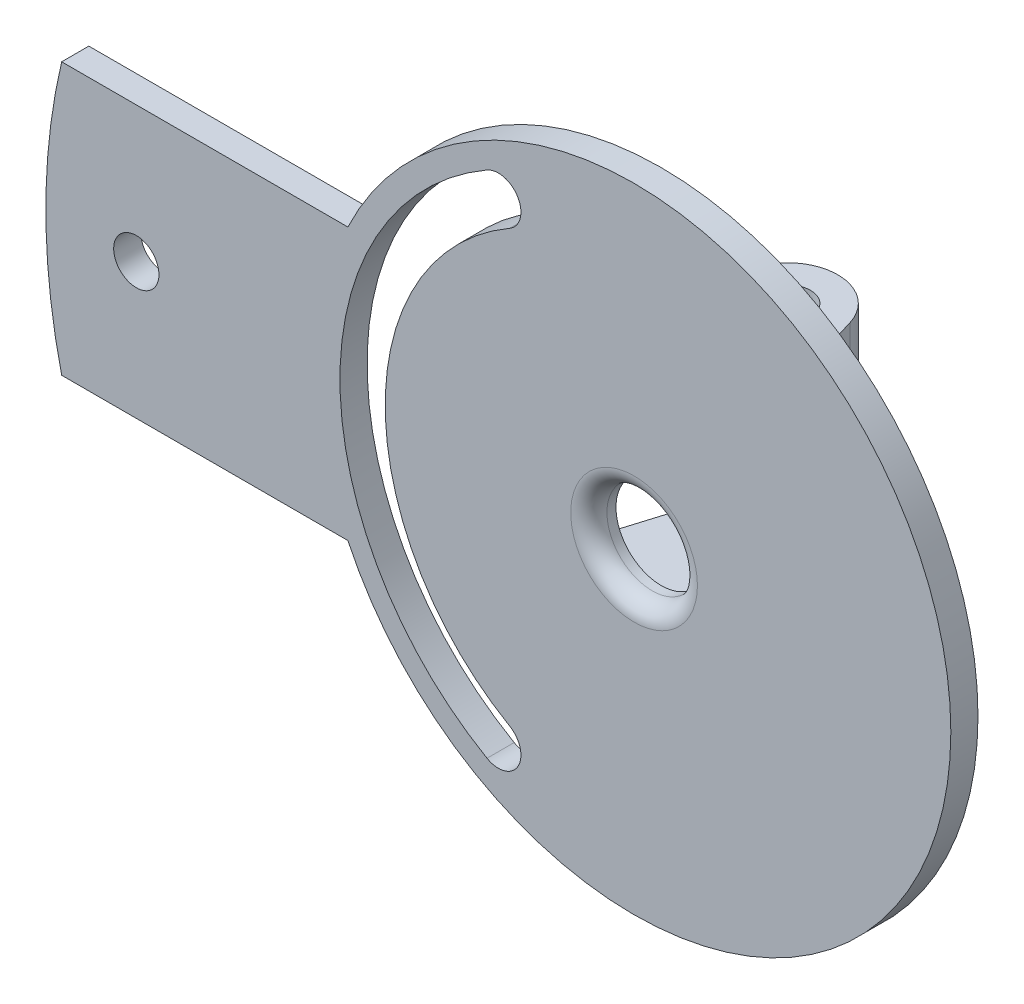
ISO-10303-21;
HEADER;
FILE_DESCRIPTION(('STEP AP214'),'2;1');
FILE_NAME('part.step','',(''),(''),'','','');
FILE_SCHEMA(('AUTOMOTIVE_DESIGN { 1 0 10303 214 1 1 1 1 }'));
ENDSEC;
DATA;
#1=APPLICATION_CONTEXT('core data for automotive mechanical design processes');
#2=APPLICATION_PROTOCOL_DEFINITION('international standard','automotive_design',2000,#1);
#3=PRODUCT_CONTEXT('',#1,'mechanical');
#4=PRODUCT('Part','Part','',(#3));
#5=PRODUCT_RELATED_PRODUCT_CATEGORY('part','',(#4));
#6=PRODUCT_DEFINITION_FORMATION('','',#4);
#7=PRODUCT_DEFINITION_CONTEXT('part definition',#1,'design');
#8=PRODUCT_DEFINITION('design','',#6,#7);
#9=PRODUCT_DEFINITION_SHAPE('','',#8);
#10=(LENGTH_UNIT() NAMED_UNIT(*) SI_UNIT(.MILLI.,.METRE.));
#11=(NAMED_UNIT(*) PLANE_ANGLE_UNIT() SI_UNIT($,.RADIAN.));
#12=(NAMED_UNIT(*) SI_UNIT($,.STERADIAN.) SOLID_ANGLE_UNIT());
#13=UNCERTAINTY_MEASURE_WITH_UNIT(LENGTH_MEASURE(1.E-05),#10,'distance_accuracy_value','');
#14=(GEOMETRIC_REPRESENTATION_CONTEXT(3) GLOBAL_UNCERTAINTY_ASSIGNED_CONTEXT((#13)) GLOBAL_UNIT_ASSIGNED_CONTEXT((#10,
#11,#12)) REPRESENTATION_CONTEXT('',''));
#15=CARTESIAN_POINT('',(0.,0.,0.));
#16=DIRECTION('',(0.,0.,1.));
#17=DIRECTION('',(1.,0.,0.));
#18=AXIS2_PLACEMENT_3D('',#15,#16,#17);
#19=CARTESIAN_POINT('',(0.,15.,-14.));
#20=DIRECTION('',(0.,-1.,0.));
#21=DIRECTION('',(0.,0.,-1.));
#22=AXIS2_PLACEMENT_3D('',#19,#20,#21);
#23=CYLINDRICAL_SURFACE('',#22,2.5);
#24=CARTESIAN_POINT('',(0.,-6.,-14.));
#25=DIRECTION('',(0.,-1.,0.));
#26=DIRECTION('',(0.,0.,-1.));
#27=AXIS2_PLACEMENT_3D('',#24,#25,#26);
#28=CIRCLE('',#27,2.5);
#29=CARTESIAN_POINT('',(0.,-6.,-16.5));
#30=VERTEX_POINT('',#29);
#31=EDGE_CURVE('E305',#30,#30,#28,.T.);
#32=ORIENTED_EDGE('',*,*,#31,.F.);
#33=EDGE_LOOP('',(#32));
#34=FACE_BOUND('',#33,.T.);
#35=CARTESIAN_POINT('',(0.,-15.,-14.));
#36=DIRECTION('',(0.,1.,0.));
#37=DIRECTION('',(0.,0.,1.));
#38=AXIS2_PLACEMENT_3D('',#35,#36,#37);
#39=CIRCLE('',#38,2.5);
#40=CARTESIAN_POINT('',(0.,-15.,-11.5));
#41=VERTEX_POINT('',#40);
#42=EDGE_CURVE('E299',#41,#41,#39,.T.);
#43=ORIENTED_EDGE('',*,*,#42,.F.);
#44=EDGE_LOOP('',(#43));
#45=FACE_BOUND('',#44,.T.);
#46=ADVANCED_FACE('F34',(#34,#45),#23,.F.);
#47=CARTESIAN_POINT('',(0.,15.,-14.));
#48=DIRECTION('',(0.,-1.,0.));
#49=DIRECTION('',(0.,0.,-1.));
#50=AXIS2_PLACEMENT_3D('',#47,#48,#49);
#51=CYLINDRICAL_SURFACE('',#50,5.5);
#52=DIRECTION('',(0.,-1.,0.));
#53=VECTOR('',#52,1.);
#54=CARTESIAN_POINT('',(-5.26264091145738,15.,-15.5983149367553));
#55=LINE('',#54,#53);
#56=CARTESIAN_POINT('',(-5.26264091145738,-6.,-15.5983149367553));
#57=VERTEX_POINT('',#56);
#58=CARTESIAN_POINT('',(-5.26264091145738,-15.,-15.5983149367553));
#59=VERTEX_POINT('',#58);
#60=EDGE_CURVE('E317',#57,#59,#55,.T.);
#61=ORIENTED_EDGE('',*,*,#60,.F.);
#62=CARTESIAN_POINT('',(0.,-6.,-14.));
#63=DIRECTION('',(0.,-1.,0.));
#64=DIRECTION('',(0.,0.,-1.));
#65=AXIS2_PLACEMENT_3D('',#62,#63,#64);
#66=CIRCLE('',#65,5.5);
#67=CARTESIAN_POINT('',(5.26264091145738,-6.,-15.5983149367553));
#68=VERTEX_POINT('',#67);
#69=EDGE_CURVE('E227',#57,#68,#66,.T.);
#70=ORIENTED_EDGE('',*,*,#69,.T.);
#71=DIRECTION('',(0.,-1.,0.));
#72=VECTOR('',#71,1.);
#73=CARTESIAN_POINT('',(5.26264091145739,15.,-15.5983149367553));
#74=LINE('',#73,#72);
#75=CARTESIAN_POINT('',(5.26264091145739,-15.,-15.5983149367553));
#76=VERTEX_POINT('',#75);
#77=EDGE_CURVE('E326',#68,#76,#74,.T.);
#78=ORIENTED_EDGE('',*,*,#77,.T.);
#79=CARTESIAN_POINT('',(0.,-15.,-14.));
#80=DIRECTION('',(0.,1.,0.));
#81=DIRECTION('',(0.,0.,1.));
#82=AXIS2_PLACEMENT_3D('',#79,#80,#81);
#83=CIRCLE('',#82,5.5);
#84=EDGE_CURVE('E312',#76,#59,#83,.T.);
#85=ORIENTED_EDGE('',*,*,#84,.T.);
#86=EDGE_LOOP('',(#61,#70,#78,#85));
#87=FACE_BOUND('',#86,.T.);
#88=ADVANCED_FACE('F264',(#87),#51,.T.);
#89=CARTESIAN_POINT('',(10.,15.,0.));
#90=DIRECTION('',(-0.95684380208316,0.,0.290602715773686));
#91=DIRECTION('',(0.290602715773686,0.,0.95684380208316));
#92=AXIS2_PLACEMENT_3D('',#89,#90,#91);
#93=PLANE('',#92);
#94=ORIENTED_EDGE('',*,*,#77,.F.);
#95=DIRECTION('',(0.290602715773686,0.,0.95684380208316));
#96=VECTOR('',#95,1.);
#97=CARTESIAN_POINT('',(10.,-6.,0.));
#98=LINE('',#97,#96);
#99=CARTESIAN_POINT('',(10.,-6.,0.));
#100=VERTEX_POINT('',#99);
#101=EDGE_CURVE('E348',#68,#100,#98,.T.);
#102=ORIENTED_EDGE('',*,*,#101,.T.);
#103=DIRECTION('',(0.,-1.,0.));
#104=VECTOR('',#103,1.);
#105=CARTESIAN_POINT('',(10.,15.,0.));
#106=LINE('',#105,#104);
#107=CARTESIAN_POINT('',(10.,-15.,0.));
#108=VERTEX_POINT('',#107);
#109=EDGE_CURVE('E329',#100,#108,#106,.T.);
#110=ORIENTED_EDGE('',*,*,#109,.T.);
#111=DIRECTION('',(-0.290602715773686,0.,-0.95684380208316));
#112=VECTOR('',#111,1.);
#113=CARTESIAN_POINT('',(10.,-15.,0.));
#114=LINE('',#113,#112);
#115=EDGE_CURVE('E321',#108,#76,#114,.T.);
#116=ORIENTED_EDGE('',*,*,#115,.T.);
#117=EDGE_LOOP('',(#94,#102,#110,#116));
#118=FACE_BOUND('',#117,.T.);
#119=ADVANCED_FACE('F271',(#118),#93,.F.);
#120=CARTESIAN_POINT('',(-10.,15.,0.));
#121=DIRECTION('',(0.95684380208316,0.,0.290602715773686));
#122=DIRECTION('',(0.290602715773686,0.,-0.95684380208316));
#123=AXIS2_PLACEMENT_3D('',#120,#121,#122);
#124=PLANE('',#123);
#125=DIRECTION('',(0.,-1.,0.));
#126=VECTOR('',#125,1.);
#127=CARTESIAN_POINT('',(-10.,15.,0.));
#128=LINE('',#127,#126);
#129=CARTESIAN_POINT('',(-10.,-6.,0.));
#130=VERTEX_POINT('',#129);
#131=CARTESIAN_POINT('',(-10.,-15.,0.));
#132=VERTEX_POINT('',#131);
#133=EDGE_CURVE('E170',#130,#132,#128,.T.);
#134=ORIENTED_EDGE('',*,*,#133,.F.);
#135=DIRECTION('',(0.290602715773686,0.,-0.95684380208316));
#136=VECTOR('',#135,1.);
#137=CARTESIAN_POINT('',(-10.,-6.,0.));
#138=LINE('',#137,#136);
#139=EDGE_CURVE('E164',#130,#57,#138,.T.);
#140=ORIENTED_EDGE('',*,*,#139,.T.);
#141=ORIENTED_EDGE('',*,*,#60,.T.);
#142=DIRECTION('',(-0.290602715773686,0.,0.95684380208316));
#143=VECTOR('',#142,1.);
#144=CARTESIAN_POINT('',(-10.,-15.,0.));
#145=LINE('',#144,#143);
#146=EDGE_CURVE('E298',#59,#132,#145,.T.);
#147=ORIENTED_EDGE('',*,*,#146,.T.);
#148=EDGE_LOOP('',(#134,#140,#141,#147));
#149=FACE_BOUND('',#148,.T.);
#150=ADVANCED_FACE('F346',(#149),#124,.F.);
#151=CARTESIAN_POINT('',(0.,0.,0.));
#152=DIRECTION('',(0.,0.,1.));
#153=DIRECTION('',(1.,0.,0.));
#154=AXIS2_PLACEMENT_3D('',#151,#152,#153);
#155=PLANE('',#154);
#156=ORIENTED_EDGE('',*,*,#109,.F.);
#157=DIRECTION('',(1.,0.,0.));
#158=VECTOR('',#157,1.);
#159=CARTESIAN_POINT('',(-10.,-6.,0.));
#160=LINE('',#159,#158);
#161=EDGE_CURVE('E49',#130,#100,#160,.T.);
#162=ORIENTED_EDGE('',*,*,#161,.F.);
#163=ORIENTED_EDGE('',*,*,#133,.T.);
#164=DIRECTION('',(1.,0.,0.));
#165=VECTOR('',#164,1.);
#166=CARTESIAN_POINT('',(-10.,-15.,0.));
#167=LINE('',#166,#165);
#168=EDGE_CURVE('E302',#132,#108,#167,.T.);
#169=ORIENTED_EDGE('',*,*,#168,.T.);
#170=EDGE_LOOP('',(#156,#162,#163,#169));
#171=FACE_BOUND('',#170,.T.);
#172=CARTESIAN_POINT('',(-55.,0.,0.));
#173=DIRECTION('',(0.,0.,1.));
#174=DIRECTION('',(1.,0.,0.));
#175=AXIS2_PLACEMENT_3D('',#172,#173,#174);
#176=CIRCLE('',#175,2.5);
#177=CARTESIAN_POINT('',(-52.5,0.,0.));
#178=VERTEX_POINT('',#177);
#179=EDGE_CURVE('E183',#178,#178,#176,.T.);
#180=ORIENTED_EDGE('',*,*,#179,.T.);
#181=EDGE_LOOP('',(#180));
#182=FACE_BOUND('',#181,.T.);
#183=CARTESIAN_POINT('',(0.,0.,0.));
#184=DIRECTION('',(0.,0.,1.));
#185=DIRECTION('',(1.,0.,0.));
#186=AXIS2_PLACEMENT_3D('',#183,#184,#185);
#187=CIRCLE('',#186,32.5000000000001);
#188=CARTESIAN_POINT('',(-16.2500000000001,28.1458256229943,0.));
#189=VERTEX_POINT('',#188);
#190=CARTESIAN_POINT('',(-16.25,-28.1458256229943,0.));
#191=VERTEX_POINT('',#190);
#192=EDGE_CURVE('E212',#189,#191,#187,.T.);
#193=ORIENTED_EDGE('',*,*,#192,.T.);
#194=CARTESIAN_POINT('',(-15.0000000000001,-25.9807621135333,0.));
#195=DIRECTION('',(0.,0.,1.));
#196=DIRECTION('',(1.,0.,0.));
#197=AXIS2_PLACEMENT_3D('',#194,#195,#196);
#198=CIRCLE('',#197,2.5);
#199=CARTESIAN_POINT('',(-13.75,-23.8156986040721,0.));
#200=VERTEX_POINT('',#199);
#201=EDGE_CURVE('E221',#191,#200,#198,.T.);
#202=ORIENTED_EDGE('',*,*,#201,.T.);
#203=CARTESIAN_POINT('',(0.,0.,0.));
#204=DIRECTION('',(0.,0.,1.));
#205=DIRECTION('',(1.,0.,0.));
#206=AXIS2_PLACEMENT_3D('',#203,#204,#205);
#207=CIRCLE('',#206,27.5000000000001);
#208=CARTESIAN_POINT('',(-13.7500000000001,23.8156986040721,0.));
#209=VERTEX_POINT('',#208);
#210=EDGE_CURVE('E218',#209,#200,#207,.T.);
#211=ORIENTED_EDGE('',*,*,#210,.F.);
#212=CARTESIAN_POINT('',(-15.,25.9807621135332,0.));
#213=DIRECTION('',(0.,0.,1.));
#214=DIRECTION('',(1.,0.,0.));
#215=AXIS2_PLACEMENT_3D('',#212,#213,#214);
#216=CIRCLE('',#215,2.5);
#217=EDGE_CURVE('E215',#209,#189,#216,.T.);
#218=ORIENTED_EDGE('',*,*,#217,.T.);
#219=EDGE_LOOP('',(#193,#202,#211,#218));
#220=FACE_BOUND('',#219,.T.);
#221=CARTESIAN_POINT('',(0.,0.,0.));
#222=DIRECTION('',(0.,0.,1.));
#223=DIRECTION('',(1.,0.,0.));
#224=AXIS2_PLACEMENT_3D('',#221,#222,#223);
#225=CIRCLE('',#224,35.);
#226=CARTESIAN_POINT('',(-31.6227766016838,-15.,0.));
#227=VERTEX_POINT('',#226);
#228=CARTESIAN_POINT('',(-31.6227766016838,15.,0.));
#229=VERTEX_POINT('',#228);
#230=EDGE_CURVE('E169',#227,#229,#225,.T.);
#231=ORIENTED_EDGE('',*,*,#230,.F.);
#232=DIRECTION('',(-1.,0.,0.));
#233=VECTOR('',#232,1.);
#234=CARTESIAN_POINT('',(0.,-15.,0.));
#235=LINE('',#234,#233);
#236=CARTESIAN_POINT('',(-63.2455532033676,-15.,0.));
#237=VERTEX_POINT('',#236);
#238=EDGE_CURVE('E209',#227,#237,#235,.T.);
#239=ORIENTED_EDGE('',*,*,#238,.T.);
#240=CARTESIAN_POINT('',(0.,0.,0.));
#241=DIRECTION('',(0.,0.,1.));
#242=DIRECTION('',(1.,0.,0.));
#243=AXIS2_PLACEMENT_3D('',#240,#241,#242);
#244=CIRCLE('',#243,65.);
#245=CARTESIAN_POINT('',(-63.2455532033676,15.,0.));
#246=VERTEX_POINT('',#245);
#247=EDGE_CURVE('E206',#246,#237,#244,.T.);
#248=ORIENTED_EDGE('',*,*,#247,.F.);
#249=DIRECTION('',(-1.,0.,0.));
#250=VECTOR('',#249,1.);
#251=CARTESIAN_POINT('',(0.,15.,0.));
#252=LINE('',#251,#250);
#253=EDGE_CURVE('E173',#229,#246,#252,.T.);
#254=ORIENTED_EDGE('',*,*,#253,.F.);
#255=EDGE_LOOP('',(#231,#239,#248,#254));
#256=FACE_BOUND('',#255,.T.);
#257=CARTESIAN_POINT('',(-10.,15.,0.));
#258=VERTEX_POINT('',#257);
#259=CARTESIAN_POINT('',(-10.,6.,0.));
#260=VERTEX_POINT('',#259);
#261=EDGE_CURVE('E161',#258,#260,#128,.T.);
#262=ORIENTED_EDGE('',*,*,#261,.T.);
#263=DIRECTION('',(1.,0.,0.));
#264=VECTOR('',#263,1.);
#265=CARTESIAN_POINT('',(-10.,6.,0.));
#266=LINE('',#265,#264);
#267=CARTESIAN_POINT('',(10.,6.,0.));
#268=VERTEX_POINT('',#267);
#269=EDGE_CURVE('E147',#260,#268,#266,.T.);
#270=ORIENTED_EDGE('',*,*,#269,.T.);
#271=CARTESIAN_POINT('',(10.,15.,0.));
#272=VERTEX_POINT('',#271);
#273=EDGE_CURVE('E175',#272,#268,#106,.T.);
#274=ORIENTED_EDGE('',*,*,#273,.F.);
#275=DIRECTION('',(1.,0.,0.));
#276=VECTOR('',#275,1.);
#277=CARTESIAN_POINT('',(-10.,15.,0.));
#278=LINE('',#277,#276);
#279=EDGE_CURVE('E57',#258,#272,#278,.T.);
#280=ORIENTED_EDGE('',*,*,#279,.F.);
#281=EDGE_LOOP('',(#262,#270,#274,#280));
#282=FACE_BOUND('',#281,.T.);
#283=CARTESIAN_POINT('',(0.,0.,0.));
#284=DIRECTION('',(0.,0.,1.));
#285=DIRECTION('',(1.,0.,0.));
#286=AXIS2_PLACEMENT_3D('',#283,#284,#285);
#287=CIRCLE('',#286,5.);
#288=CARTESIAN_POINT('',(5.,0.,0.));
#289=VERTEX_POINT('',#288);
#290=EDGE_CURVE('E224',#289,#289,#287,.T.);
#291=ORIENTED_EDGE('',*,*,#290,.T.);
#292=EDGE_LOOP('',(#291));
#293=FACE_BOUND('',#292,.T.);
#294=ADVANCED_FACE('F167',(#171,#182,#220,#256,#282,#293),#155,.F.);
#295=CARTESIAN_POINT('',(0.,0.,3.));
#296=DIRECTION('',(0.,0.,-1.));
#297=DIRECTION('',(-1.,0.,0.));
#298=AXIS2_PLACEMENT_3D('',#295,#296,#297);
#299=CYLINDRICAL_SURFACE('',#298,32.5000000000001);
#300=ORIENTED_EDGE('',*,*,#192,.F.);
#301=DIRECTION('',(0.,0.,-1.));
#302=VECTOR('',#301,1.);
#303=CARTESIAN_POINT('',(-16.2500000000001,28.1458256229943,3.));
#304=LINE('',#303,#302);
#305=CARTESIAN_POINT('',(-16.2500000000001,28.1458256229943,3.));
#306=VERTEX_POINT('',#305);
#307=EDGE_CURVE('E165',#306,#189,#304,.T.);
#308=ORIENTED_EDGE('',*,*,#307,.F.);
#309=CARTESIAN_POINT('',(0.,0.,3.));
#310=DIRECTION('',(0.,0.,1.));
#311=DIRECTION('',(1.,0.,0.));
#312=AXIS2_PLACEMENT_3D('',#309,#310,#311);
#313=CIRCLE('',#312,32.5000000000001);
#314=CARTESIAN_POINT('',(-16.25,-28.1458256229943,3.));
#315=VERTEX_POINT('',#314);
#316=EDGE_CURVE('E190',#306,#315,#313,.T.);
#317=ORIENTED_EDGE('',*,*,#316,.T.);
#318=DIRECTION('',(0.,0.,-1.));
#319=VECTOR('',#318,1.);
#320=CARTESIAN_POINT('',(-16.25,-28.1458256229943,3.));
#321=LINE('',#320,#319);
#322=EDGE_CURVE('E231',#315,#191,#321,.T.);
#323=ORIENTED_EDGE('',*,*,#322,.T.);
#324=EDGE_LOOP('',(#300,#308,#317,#323));
#325=FACE_BOUND('',#324,.T.);
#326=ADVANCED_FACE('F373',(#325),#299,.F.);
#327=CARTESIAN_POINT('',(-15.,25.9807621135332,3.));
#328=DIRECTION('',(0.,0.,-1.));
#329=DIRECTION('',(-1.,0.,0.));
#330=AXIS2_PLACEMENT_3D('',#327,#328,#329);
#331=CYLINDRICAL_SURFACE('',#330,2.5);
#332=ORIENTED_EDGE('',*,*,#217,.F.);
#333=DIRECTION('',(0.,0.,-1.));
#334=VECTOR('',#333,1.);
#335=CARTESIAN_POINT('',(-13.7500000000001,23.8156986040721,3.));
#336=LINE('',#335,#334);
#337=CARTESIAN_POINT('',(-13.7500000000001,23.8156986040721,3.));
#338=VERTEX_POINT('',#337);
#339=EDGE_CURVE('E236',#338,#209,#336,.T.);
#340=ORIENTED_EDGE('',*,*,#339,.F.);
#341=CARTESIAN_POINT('',(-15.,25.9807621135332,3.));
#342=DIRECTION('',(0.,0.,1.));
#343=DIRECTION('',(1.,0.,0.));
#344=AXIS2_PLACEMENT_3D('',#341,#342,#343);
#345=CIRCLE('',#344,2.5);
#346=EDGE_CURVE('E193',#338,#306,#345,.T.);
#347=ORIENTED_EDGE('',*,*,#346,.T.);
#348=ORIENTED_EDGE('',*,*,#307,.T.);
#349=EDGE_LOOP('',(#332,#340,#347,#348));
#350=FACE_BOUND('',#349,.T.);
#351=ADVANCED_FACE('F389',(#350),#331,.F.);
#352=CARTESIAN_POINT('',(0.,0.,3.));
#353=DIRECTION('',(0.,0.,-1.));
#354=DIRECTION('',(-1.,0.,0.));
#355=AXIS2_PLACEMENT_3D('',#352,#353,#354);
#356=CYLINDRICAL_SURFACE('',#355,27.5000000000001);
#357=ORIENTED_EDGE('',*,*,#210,.T.);
#358=DIRECTION('',(0.,0.,-1.));
#359=VECTOR('',#358,1.);
#360=CARTESIAN_POINT('',(-13.75,-23.8156986040721,3.));
#361=LINE('',#360,#359);
#362=CARTESIAN_POINT('',(-13.75,-23.8156986040721,3.));
#363=VERTEX_POINT('',#362);
#364=EDGE_CURVE('E233',#363,#200,#361,.T.);
#365=ORIENTED_EDGE('',*,*,#364,.F.);
#366=CARTESIAN_POINT('',(0.,0.,3.));
#367=DIRECTION('',(0.,0.,1.));
#368=DIRECTION('',(1.,0.,0.));
#369=AXIS2_PLACEMENT_3D('',#366,#367,#368);
#370=CIRCLE('',#369,27.5000000000001);
#371=EDGE_CURVE('E196',#338,#363,#370,.T.);
#372=ORIENTED_EDGE('',*,*,#371,.F.);
#373=ORIENTED_EDGE('',*,*,#339,.T.);
#374=EDGE_LOOP('',(#357,#365,#372,#373));
#375=FACE_BOUND('',#374,.T.);
#376=ADVANCED_FACE('F385',(#375),#356,.T.);
#377=CARTESIAN_POINT('',(0.,0.,3.));
#378=DIRECTION('',(0.,0.,-1.));
#379=DIRECTION('',(-1.,0.,0.));
#380=AXIS2_PLACEMENT_3D('',#377,#378,#379);
#381=CYLINDRICAL_SURFACE('',#380,35.);
#382=ORIENTED_EDGE('',*,*,#230,.T.);
#383=DIRECTION('',(0.,0.,-1.));
#384=VECTOR('',#383,1.);
#385=CARTESIAN_POINT('',(-31.6227766016838,15.,3.));
#386=LINE('',#385,#384);
#387=CARTESIAN_POINT('',(-31.6227766016838,15.,3.));
#388=VERTEX_POINT('',#387);
#389=EDGE_CURVE('E234',#388,#229,#386,.T.);
#390=ORIENTED_EDGE('',*,*,#389,.F.);
#391=CARTESIAN_POINT('',(0.,0.,3.));
#392=DIRECTION('',(0.,0.,1.));
#393=DIRECTION('',(1.,0.,0.));
#394=AXIS2_PLACEMENT_3D('',#391,#392,#393);
#395=CIRCLE('',#394,35.);
#396=CARTESIAN_POINT('',(-31.6227766016838,-15.,3.));
#397=VERTEX_POINT('',#396);
#398=EDGE_CURVE('E179',#397,#388,#395,.T.);
#399=ORIENTED_EDGE('',*,*,#398,.F.);
#400=DIRECTION('',(0.,0.,-1.));
#401=VECTOR('',#400,1.);
#402=CARTESIAN_POINT('',(-31.6227766016838,-15.,3.));
#403=LINE('',#402,#401);
#404=EDGE_CURVE('E203',#397,#227,#403,.T.);
#405=ORIENTED_EDGE('',*,*,#404,.T.);
#406=EDGE_LOOP('',(#382,#390,#399,#405));
#407=FACE_BOUND('',#406,.T.);
#408=ADVANCED_FACE('F388',(#407),#381,.T.);
#409=CARTESIAN_POINT('',(0.,15.,3.));
#410=DIRECTION('',(0.,-1.,0.));
#411=DIRECTION('',(1.,0.,0.));
#412=AXIS2_PLACEMENT_3D('',#409,#410,#411);
#413=PLANE('',#412);
#414=ORIENTED_EDGE('',*,*,#253,.T.);
#415=DIRECTION('',(0.,0.,-1.));
#416=VECTOR('',#415,1.);
#417=CARTESIAN_POINT('',(-63.2455532033676,15.,3.));
#418=LINE('',#417,#416);
#419=CARTESIAN_POINT('',(-63.2455532033676,15.,3.));
#420=VERTEX_POINT('',#419);
#421=EDGE_CURVE('E242',#420,#246,#418,.T.);
#422=ORIENTED_EDGE('',*,*,#421,.F.);
#423=DIRECTION('',(-1.,0.,0.));
#424=VECTOR('',#423,1.);
#425=CARTESIAN_POINT('',(0.,15.,3.));
#426=LINE('',#425,#424);
#427=EDGE_CURVE('E182',#388,#420,#426,.T.);
#428=ORIENTED_EDGE('',*,*,#427,.F.);
#429=ORIENTED_EDGE('',*,*,#389,.T.);
#430=EDGE_LOOP('',(#414,#422,#428,#429));
#431=FACE_BOUND('',#430,.T.);
#432=ADVANCED_FACE('F402',(#431),#413,.F.);
#433=CARTESIAN_POINT('',(0.,0.,3.));
#434=DIRECTION('',(0.,0.,-1.));
#435=DIRECTION('',(-1.,0.,0.));
#436=AXIS2_PLACEMENT_3D('',#433,#434,#435);
#437=CYLINDRICAL_SURFACE('',#436,65.);
#438=ORIENTED_EDGE('',*,*,#247,.T.);
#439=DIRECTION('',(0.,0.,-1.));
#440=VECTOR('',#439,1.);
#441=CARTESIAN_POINT('',(-63.2455532033676,-15.,3.));
#442=LINE('',#441,#440);
#443=CARTESIAN_POINT('',(-63.2455532033676,-15.,3.));
#444=VERTEX_POINT('',#443);
#445=EDGE_CURVE('E240',#444,#237,#442,.T.);
#446=ORIENTED_EDGE('',*,*,#445,.F.);
#447=CARTESIAN_POINT('',(0.,0.,3.));
#448=DIRECTION('',(0.,0.,1.));
#449=DIRECTION('',(1.,0.,0.));
#450=AXIS2_PLACEMENT_3D('',#447,#448,#449);
#451=CIRCLE('',#450,65.);
#452=EDGE_CURVE('E185',#420,#444,#451,.T.);
#453=ORIENTED_EDGE('',*,*,#452,.F.);
#454=ORIENTED_EDGE('',*,*,#421,.T.);
#455=EDGE_LOOP('',(#438,#446,#453,#454));
#456=FACE_BOUND('',#455,.T.);
#457=ADVANCED_FACE('F381',(#456),#437,.T.);
#458=CARTESIAN_POINT('',(0.,0.,3.));
#459=DIRECTION('',(0.,0.,-1.));
#460=DIRECTION('',(-1.,0.,0.));
#461=AXIS2_PLACEMENT_3D('',#458,#459,#460);
#462=CYLINDRICAL_SURFACE('',#461,5.);
#463=CARTESIAN_POINT('',(0.,0.,1.));
#464=DIRECTION('',(0.,0.,1.));
#465=DIRECTION('',(1.,0.,0.));
#466=AXIS2_PLACEMENT_3D('',#463,#464,#465);
#467=CIRCLE('',#466,5.);
#468=CARTESIAN_POINT('',(5.,0.,1.));
#469=VERTEX_POINT('',#468);
#470=EDGE_CURVE('E42',#469,#469,#467,.T.);
#471=ORIENTED_EDGE('',*,*,#470,.T.);
#472=EDGE_LOOP('',(#471));
#473=FACE_BOUND('',#472,.T.);
#474=ORIENTED_EDGE('',*,*,#290,.F.);
#475=EDGE_LOOP('',(#474));
#476=FACE_BOUND('',#475,.T.);
#477=ADVANCED_FACE('F251',(#473,#476),#462,.F.);
#478=CARTESIAN_POINT('',(-15.0000000000001,-25.9807621135333,3.));
#479=DIRECTION('',(0.,0.,-1.));
#480=DIRECTION('',(-1.,0.,0.));
#481=AXIS2_PLACEMENT_3D('',#478,#479,#480);
#482=CYLINDRICAL_SURFACE('',#481,2.5);
#483=ORIENTED_EDGE('',*,*,#201,.F.);
#484=ORIENTED_EDGE('',*,*,#322,.F.);
#485=CARTESIAN_POINT('',(-15.0000000000001,-25.9807621135333,3.));
#486=DIRECTION('',(0.,0.,1.));
#487=DIRECTION('',(1.,0.,0.));
#488=AXIS2_PLACEMENT_3D('',#485,#486,#487);
#489=CIRCLE('',#488,2.5);
#490=EDGE_CURVE('E198',#315,#363,#489,.T.);
#491=ORIENTED_EDGE('',*,*,#490,.T.);
#492=ORIENTED_EDGE('',*,*,#364,.T.);
#493=EDGE_LOOP('',(#483,#484,#491,#492));
#494=FACE_BOUND('',#493,.T.);
#495=ADVANCED_FACE('F380',(#494),#482,.F.);
#496=CARTESIAN_POINT('',(0.,-15.,3.));
#497=DIRECTION('',(0.,-1.,0.));
#498=DIRECTION('',(1.,0.,0.));
#499=AXIS2_PLACEMENT_3D('',#496,#497,#498);
#500=PLANE('',#499);
#501=ORIENTED_EDGE('',*,*,#238,.F.);
#502=ORIENTED_EDGE('',*,*,#404,.F.);
#503=DIRECTION('',(-1.,0.,0.));
#504=VECTOR('',#503,1.);
#505=CARTESIAN_POINT('',(0.,-15.,3.));
#506=LINE('',#505,#504);
#507=EDGE_CURVE('E187',#397,#444,#506,.T.);
#508=ORIENTED_EDGE('',*,*,#507,.T.);
#509=ORIENTED_EDGE('',*,*,#445,.T.);
#510=EDGE_LOOP('',(#501,#502,#508,#509));
#511=FACE_BOUND('',#510,.T.);
#512=ADVANCED_FACE('F376',(#511),#500,.T.);
#513=CARTESIAN_POINT('',(-55.,0.,3.));
#514=DIRECTION('',(0.,0.,-1.));
#515=DIRECTION('',(-1.,0.,0.));
#516=AXIS2_PLACEMENT_3D('',#513,#514,#515);
#517=CYLINDRICAL_SURFACE('',#516,2.5);
#518=CARTESIAN_POINT('',(-55.,0.,3.));
#519=DIRECTION('',(0.,0.,1.));
#520=DIRECTION('',(1.,0.,0.));
#521=AXIS2_PLACEMENT_3D('',#518,#519,#520);
#522=CIRCLE('',#521,2.5);
#523=CARTESIAN_POINT('',(-52.5,0.,3.));
#524=VERTEX_POINT('',#523);
#525=EDGE_CURVE('E201',#524,#524,#522,.T.);
#526=ORIENTED_EDGE('',*,*,#525,.T.);
#527=EDGE_LOOP('',(#526));
#528=FACE_BOUND('',#527,.T.);
#529=ORIENTED_EDGE('',*,*,#179,.F.);
#530=EDGE_LOOP('',(#529));
#531=FACE_BOUND('',#530,.T.);
#532=ADVANCED_FACE('F288',(#528,#531),#517,.F.);
#533=CARTESIAN_POINT('',(0.,0.,3.));
#534=DIRECTION('',(0.,0.,1.));
#535=DIRECTION('',(1.,0.,0.));
#536=AXIS2_PLACEMENT_3D('',#533,#534,#535);
#537=PLANE('',#536);
#538=CARTESIAN_POINT('',(0.,0.,3.));
#539=DIRECTION('',(0.,0.,1.));
#540=DIRECTION('',(1.,0.,0.));
#541=AXIS2_PLACEMENT_3D('',#538,#539,#540);
#542=CIRCLE('',#541,7.);
#543=CARTESIAN_POINT('',(7.,0.,3.));
#544=VERTEX_POINT('',#543);
#545=EDGE_CURVE('E11',#544,#544,#542,.F.);
#546=ORIENTED_EDGE('',*,*,#545,.T.);
#547=EDGE_LOOP('',(#546));
#548=FACE_BOUND('',#547,.T.);
#549=ORIENTED_EDGE('',*,*,#398,.T.);
#550=ORIENTED_EDGE('',*,*,#427,.T.);
#551=ORIENTED_EDGE('',*,*,#452,.T.);
#552=ORIENTED_EDGE('',*,*,#507,.F.);
#553=EDGE_LOOP('',(#549,#550,#551,#552));
#554=FACE_BOUND('',#553,.T.);
#555=ORIENTED_EDGE('',*,*,#316,.F.);
#556=ORIENTED_EDGE('',*,*,#346,.F.);
#557=ORIENTED_EDGE('',*,*,#371,.T.);
#558=ORIENTED_EDGE('',*,*,#490,.F.);
#559=EDGE_LOOP('',(#555,#556,#557,#558));
#560=FACE_BOUND('',#559,.T.);
#561=ORIENTED_EDGE('',*,*,#525,.F.);
#562=EDGE_LOOP('',(#561));
#563=FACE_BOUND('',#562,.T.);
#564=ADVANCED_FACE('F280',(#548,#554,#560,#563),#537,.T.);
#565=CARTESIAN_POINT('',(0.,6.00000000000001,-14.));
#566=DIRECTION('',(0.,1.,0.));
#567=DIRECTION('',(0.,0.,1.));
#568=AXIS2_PLACEMENT_3D('',#565,#566,#567);
#569=CIRCLE('',#568,2.5);
#570=CARTESIAN_POINT('',(0.,6.00000000000001,-11.5));
#571=VERTEX_POINT('',#570);
#572=EDGE_CURVE('E228',#571,#571,#569,.T.);
#573=ORIENTED_EDGE('',*,*,#572,.F.);
#574=EDGE_LOOP('',(#573));
#575=FACE_BOUND('',#574,.T.);
#576=CARTESIAN_POINT('',(0.,15.,-14.));
#577=DIRECTION('',(0.,1.,0.));
#578=DIRECTION('',(0.,0.,1.));
#579=AXIS2_PLACEMENT_3D('',#576,#577,#578);
#580=CIRCLE('',#579,2.5);
#581=CARTESIAN_POINT('',(0.,15.,-11.5));
#582=VERTEX_POINT('',#581);
#583=EDGE_CURVE('E296',#582,#582,#580,.T.);
#584=ORIENTED_EDGE('',*,*,#583,.T.);
#585=EDGE_LOOP('',(#584));
#586=FACE_BOUND('',#585,.T.);
#587=ADVANCED_FACE('F267',(#575,#586),#23,.F.);
#588=CARTESIAN_POINT('',(5.26264091145739,15.,-15.5983149367553));
#589=VERTEX_POINT('',#588);
#590=CARTESIAN_POINT('',(5.26264091145738,6.00000000000001,-15.5983149367553));
#591=VERTEX_POINT('',#590);
#592=EDGE_CURVE('E327',#589,#591,#74,.T.);
#593=ORIENTED_EDGE('',*,*,#592,.T.);
#594=CARTESIAN_POINT('',(0.,6.00000000000001,-14.));
#595=DIRECTION('',(0.,1.,0.));
#596=DIRECTION('',(0.,0.,1.));
#597=AXIS2_PLACEMENT_3D('',#594,#595,#596);
#598=CIRCLE('',#597,5.5);
#599=CARTESIAN_POINT('',(-5.26264091145738,6.00000000000001,-15.5983149367553));
#600=VERTEX_POINT('',#599);
#601=EDGE_CURVE('E353',#591,#600,#598,.T.);
#602=ORIENTED_EDGE('',*,*,#601,.T.);
#603=CARTESIAN_POINT('',(-5.26264091145738,15.,-15.5983149367553));
#604=VERTEX_POINT('',#603);
#605=EDGE_CURVE('E163',#604,#600,#55,.T.);
#606=ORIENTED_EDGE('',*,*,#605,.F.);
#607=CARTESIAN_POINT('',(0.,15.,-14.));
#608=DIRECTION('',(0.,1.,0.));
#609=DIRECTION('',(0.,0.,1.));
#610=AXIS2_PLACEMENT_3D('',#607,#608,#609);
#611=CIRCLE('',#610,5.5);
#612=EDGE_CURVE('E316',#589,#604,#611,.T.);
#613=ORIENTED_EDGE('',*,*,#612,.F.);
#614=EDGE_LOOP('',(#593,#602,#606,#613));
#615=FACE_BOUND('',#614,.T.);
#616=ADVANCED_FACE('F274',(#615),#51,.T.);
#617=ORIENTED_EDGE('',*,*,#273,.T.);
#618=DIRECTION('',(-0.290602715773686,0.,-0.95684380208316));
#619=VECTOR('',#618,1.);
#620=CARTESIAN_POINT('',(10.,6.,0.));
#621=LINE('',#620,#619);
#622=EDGE_CURVE('E153',#268,#591,#621,.T.);
#623=ORIENTED_EDGE('',*,*,#622,.T.);
#624=ORIENTED_EDGE('',*,*,#592,.F.);
#625=DIRECTION('',(-0.290602715773686,0.,-0.95684380208316));
#626=VECTOR('',#625,1.);
#627=CARTESIAN_POINT('',(10.,15.,0.));
#628=LINE('',#627,#626);
#629=EDGE_CURVE('E314',#272,#589,#628,.T.);
#630=ORIENTED_EDGE('',*,*,#629,.F.);
#631=EDGE_LOOP('',(#617,#623,#624,#630));
#632=FACE_BOUND('',#631,.T.);
#633=ADVANCED_FACE('F286',(#632),#93,.F.);
#634=ORIENTED_EDGE('',*,*,#605,.T.);
#635=DIRECTION('',(-0.290602715773686,0.,0.95684380208316));
#636=VECTOR('',#635,1.);
#637=CARTESIAN_POINT('',(-10.,6.,0.));
#638=LINE('',#637,#636);
#639=EDGE_CURVE('E150',#600,#260,#638,.T.);
#640=ORIENTED_EDGE('',*,*,#639,.T.);
#641=ORIENTED_EDGE('',*,*,#261,.F.);
#642=DIRECTION('',(-0.290602715773686,0.,0.95684380208316));
#643=VECTOR('',#642,1.);
#644=CARTESIAN_POINT('',(-10.,15.,0.));
#645=LINE('',#644,#643);
#646=EDGE_CURVE('E310',#604,#258,#645,.T.);
#647=ORIENTED_EDGE('',*,*,#646,.F.);
#648=EDGE_LOOP('',(#634,#640,#641,#647));
#649=FACE_BOUND('',#648,.T.);
#650=ADVANCED_FACE('F159',(#649),#124,.F.);
#651=CARTESIAN_POINT('',(0.,-15.,-14.));
#652=DIRECTION('',(0.,1.,0.));
#653=DIRECTION('',(0.,0.,1.));
#654=AXIS2_PLACEMENT_3D('',#651,#652,#653);
#655=PLANE('',#654);
#656=ORIENTED_EDGE('',*,*,#146,.F.);
#657=ORIENTED_EDGE('',*,*,#84,.F.);
#658=ORIENTED_EDGE('',*,*,#115,.F.);
#659=ORIENTED_EDGE('',*,*,#168,.F.);
#660=EDGE_LOOP('',(#656,#657,#658,#659));
#661=FACE_BOUND('',#660,.T.);
#662=ORIENTED_EDGE('',*,*,#42,.T.);
#663=EDGE_LOOP('',(#662));
#664=FACE_BOUND('',#663,.T.);
#665=ADVANCED_FACE('F342',(#661,#664),#655,.F.);
#666=CARTESIAN_POINT('',(0.,15.,-14.));
#667=DIRECTION('',(0.,1.,0.));
#668=DIRECTION('',(0.,0.,1.));
#669=AXIS2_PLACEMENT_3D('',#666,#667,#668);
#670=PLANE('',#669);
#671=ORIENTED_EDGE('',*,*,#646,.T.);
#672=ORIENTED_EDGE('',*,*,#279,.T.);
#673=ORIENTED_EDGE('',*,*,#629,.T.);
#674=ORIENTED_EDGE('',*,*,#612,.T.);
#675=EDGE_LOOP('',(#671,#672,#673,#674));
#676=FACE_BOUND('',#675,.T.);
#677=ORIENTED_EDGE('',*,*,#583,.F.);
#678=EDGE_LOOP('',(#677));
#679=FACE_BOUND('',#678,.T.);
#680=ADVANCED_FACE('F358',(#676,#679),#670,.T.);
#681=CARTESIAN_POINT('',(-10.,-6.,0.));
#682=DIRECTION('',(0.,-1.,0.));
#683=DIRECTION('',(0.,0.,-1.));
#684=AXIS2_PLACEMENT_3D('',#681,#682,#683);
#685=PLANE('',#684);
#686=ORIENTED_EDGE('',*,*,#31,.T.);
#687=EDGE_LOOP('',(#686));
#688=FACE_BOUND('',#687,.T.);
#689=ORIENTED_EDGE('',*,*,#69,.F.);
#690=ORIENTED_EDGE('',*,*,#139,.F.);
#691=ORIENTED_EDGE('',*,*,#161,.T.);
#692=ORIENTED_EDGE('',*,*,#101,.F.);
#693=EDGE_LOOP('',(#689,#690,#691,#692));
#694=FACE_BOUND('',#693,.T.);
#695=ADVANCED_FACE('F259',(#688,#694),#685,.F.);
#696=CARTESIAN_POINT('',(-10.,6.00000000000002,-25.));
#697=DIRECTION('',(0.,1.,0.));
#698=DIRECTION('',(0.,0.,1.));
#699=AXIS2_PLACEMENT_3D('',#696,#697,#698);
#700=PLANE('',#699);
#701=ORIENTED_EDGE('',*,*,#572,.T.);
#702=EDGE_LOOP('',(#701));
#703=FACE_BOUND('',#702,.T.);
#704=ORIENTED_EDGE('',*,*,#269,.F.);
#705=ORIENTED_EDGE('',*,*,#639,.F.);
#706=ORIENTED_EDGE('',*,*,#601,.F.);
#707=ORIENTED_EDGE('',*,*,#622,.F.);
#708=EDGE_LOOP('',(#704,#705,#706,#707));
#709=FACE_BOUND('',#708,.T.);
#710=ADVANCED_FACE('F149',(#703,#709),#700,.F.);
#711=CARTESIAN_POINT('',(0.,0.,1.));
#712=DIRECTION('',(0.,0.,1.));
#713=DIRECTION('',(1.,0.,0.));
#714=AXIS2_PLACEMENT_3D('',#711,#712,#713);
#715=TOROIDAL_SURFACE('',#714,7.,2.);
#716=ORIENTED_EDGE('',*,*,#545,.F.);
#717=EDGE_LOOP('',(#716));
#718=FACE_BOUND('',#717,.T.);
#719=ORIENTED_EDGE('',*,*,#470,.F.);
#720=EDGE_LOOP('',(#719));
#721=FACE_BOUND('',#720,.T.);
#722=ADVANCED_FACE('F36',(#718,#721),#715,.T.);
#723=CLOSED_SHELL('',(#46,#88,#119,#150,#294,#326,#351,#376,#408,#432,#457,#477,#495,#512,#532,
#564,#587,#616,#633,#650,#665,#680,#695,#710,#722));
#724=MANIFOLD_SOLID_BREP('B2',#723);
#725=ADVANCED_BREP_SHAPE_REPRESENTATION('',(#18,#724),#14);
#726=SHAPE_DEFINITION_REPRESENTATION(#9,#725);
ENDSEC;
END-ISO-10303-21;
